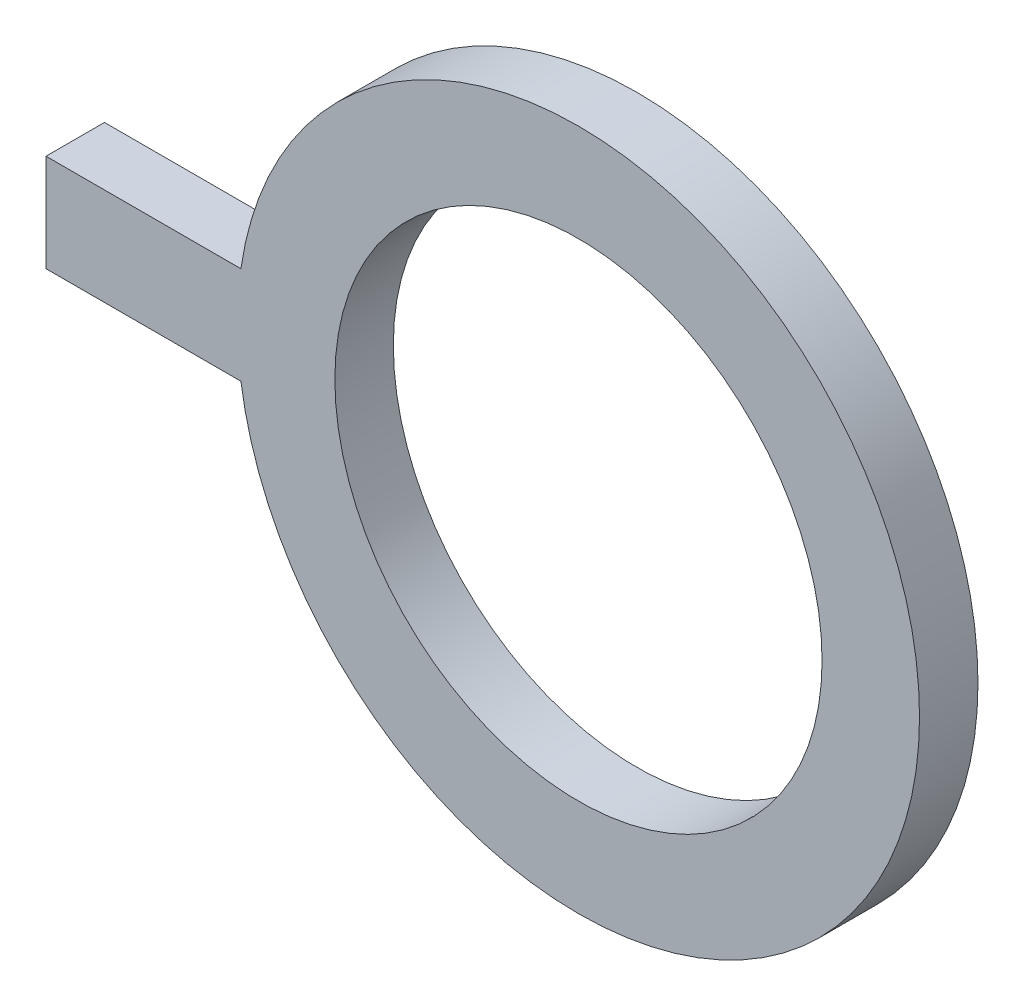
ISO-10303-21;
HEADER;
FILE_DESCRIPTION(('STEP AP214'),'2;1');
FILE_NAME('part.step','',(''),(''),'','','');
FILE_SCHEMA(('AUTOMOTIVE_DESIGN { 1 0 10303 214 1 1 1 1 }'));
ENDSEC;
DATA;
#1=APPLICATION_CONTEXT('core data for automotive mechanical design processes');
#2=APPLICATION_PROTOCOL_DEFINITION('international standard','automotive_design',2000,#1);
#3=PRODUCT_CONTEXT('',#1,'mechanical');
#4=PRODUCT('Part','Part','',(#3));
#5=PRODUCT_RELATED_PRODUCT_CATEGORY('part','',(#4));
#6=PRODUCT_DEFINITION_FORMATION('','',#4);
#7=PRODUCT_DEFINITION_CONTEXT('part definition',#1,'design');
#8=PRODUCT_DEFINITION('design','',#6,#7);
#9=PRODUCT_DEFINITION_SHAPE('','',#8);
#10=(LENGTH_UNIT() NAMED_UNIT(*) SI_UNIT(.MILLI.,.METRE.));
#11=(NAMED_UNIT(*) PLANE_ANGLE_UNIT() SI_UNIT($,.RADIAN.));
#12=(NAMED_UNIT(*) SI_UNIT($,.STERADIAN.) SOLID_ANGLE_UNIT());
#13=UNCERTAINTY_MEASURE_WITH_UNIT(LENGTH_MEASURE(1.E-05),#10,'distance_accuracy_value','');
#14=(GEOMETRIC_REPRESENTATION_CONTEXT(3) GLOBAL_UNCERTAINTY_ASSIGNED_CONTEXT((#13)) GLOBAL_UNIT_ASSIGNED_CONTEXT((#10,
#11,#12)) REPRESENTATION_CONTEXT('',''));
#15=CARTESIAN_POINT('',(0.,0.,0.));
#16=DIRECTION('',(0.,0.,1.));
#17=DIRECTION('',(1.,0.,0.));
#18=AXIS2_PLACEMENT_3D('',#15,#16,#17);
#19=CARTESIAN_POINT('',(0.,0.,6.));
#20=DIRECTION('',(0.,0.,1.));
#21=DIRECTION('',(1.,0.,0.));
#22=AXIS2_PLACEMENT_3D('',#19,#20,#21);
#23=PLANE('',#22);
#24=CARTESIAN_POINT('',(0.,0.,6.));
#25=DIRECTION('',(0.,0.,1.));
#26=DIRECTION('',(1.,0.,0.));
#27=AXIS2_PLACEMENT_3D('',#24,#25,#26);
#28=CIRCLE('',#27,35.);
#29=CARTESIAN_POINT('',(-34.6410161513775,-5.,6.));
#30=VERTEX_POINT('',#29);
#31=CARTESIAN_POINT('',(-34.6410161513775,5.,6.));
#32=VERTEX_POINT('',#31);
#33=EDGE_CURVE('E98',#30,#32,#28,.T.);
#34=ORIENTED_EDGE('',*,*,#33,.T.);
#35=DIRECTION('',(-1.,0.,0.));
#36=VECTOR('',#35,1.);
#37=CARTESIAN_POINT('',(-34.6410161513775,5.,6.));
#38=LINE('',#37,#36);
#39=CARTESIAN_POINT('',(-54.6410161513775,5.,6.));
#40=VERTEX_POINT('',#39);
#41=EDGE_CURVE('E93',#32,#40,#38,.T.);
#42=ORIENTED_EDGE('',*,*,#41,.T.);
#43=DIRECTION('',(0.,-1.,0.));
#44=VECTOR('',#43,1.);
#45=CARTESIAN_POINT('',(-54.6410161513775,-5.,6.));
#46=LINE('',#45,#44);
#47=CARTESIAN_POINT('',(-54.6410161513775,-5.,6.));
#48=VERTEX_POINT('',#47);
#49=EDGE_CURVE('E96',#40,#48,#46,.T.);
#50=ORIENTED_EDGE('',*,*,#49,.T.);
#51=DIRECTION('',(1.,0.,0.));
#52=VECTOR('',#51,1.);
#53=CARTESIAN_POINT('',(-34.6410161513775,-5.,6.));
#54=LINE('',#53,#52);
#55=EDGE_CURVE('E63',#48,#30,#54,.T.);
#56=ORIENTED_EDGE('',*,*,#55,.T.);
#57=EDGE_LOOP('',(#34,#42,#50,#56));
#58=FACE_BOUND('',#57,.T.);
#59=CARTESIAN_POINT('',(0.,0.,6.));
#60=DIRECTION('',(0.,0.,1.));
#61=DIRECTION('',(1.,0.,0.));
#62=AXIS2_PLACEMENT_3D('',#59,#60,#61);
#63=CIRCLE('',#62,25.);
#64=CARTESIAN_POINT('',(25.,0.,6.));
#65=VERTEX_POINT('',#64);
#66=EDGE_CURVE('E118',#65,#65,#63,.T.);
#67=ORIENTED_EDGE('',*,*,#66,.F.);
#68=EDGE_LOOP('',(#67));
#69=FACE_BOUND('',#68,.T.);
#70=ADVANCED_FACE('F45',(#58,#69),#23,.T.);
#71=CARTESIAN_POINT('',(0.,0.,0.));
#72=DIRECTION('',(0.,0.,1.));
#73=DIRECTION('',(1.,0.,0.));
#74=AXIS2_PLACEMENT_3D('',#71,#72,#73);
#75=PLANE('',#74);
#76=CARTESIAN_POINT('',(0.,0.,0.));
#77=DIRECTION('',(0.,0.,1.));
#78=DIRECTION('',(1.,0.,0.));
#79=AXIS2_PLACEMENT_3D('',#76,#77,#78);
#80=CIRCLE('',#79,35.);
#81=CARTESIAN_POINT('',(-34.6410161513775,-5.,0.));
#82=VERTEX_POINT('',#81);
#83=CARTESIAN_POINT('',(-34.6410161513775,5.,0.));
#84=VERTEX_POINT('',#83);
#85=EDGE_CURVE('E114',#82,#84,#80,.T.);
#86=ORIENTED_EDGE('',*,*,#85,.F.);
#87=DIRECTION('',(1.,0.,0.));
#88=VECTOR('',#87,1.);
#89=CARTESIAN_POINT('',(-34.6410161513775,-5.,0.));
#90=LINE('',#89,#88);
#91=CARTESIAN_POINT('',(-54.6410161513775,-5.,0.));
#92=VERTEX_POINT('',#91);
#93=EDGE_CURVE('E86',#92,#82,#90,.T.);
#94=ORIENTED_EDGE('',*,*,#93,.F.);
#95=DIRECTION('',(0.,-1.,0.));
#96=VECTOR('',#95,1.);
#97=CARTESIAN_POINT('',(-54.6410161513775,-5.,0.));
#98=LINE('',#97,#96);
#99=CARTESIAN_POINT('',(-54.6410161513775,5.,0.));
#100=VERTEX_POINT('',#99);
#101=EDGE_CURVE('E80',#100,#92,#98,.T.);
#102=ORIENTED_EDGE('',*,*,#101,.F.);
#103=DIRECTION('',(-1.,0.,0.));
#104=VECTOR('',#103,1.);
#105=CARTESIAN_POINT('',(-34.6410161513775,5.,0.));
#106=LINE('',#105,#104);
#107=EDGE_CURVE('E103',#84,#100,#106,.T.);
#108=ORIENTED_EDGE('',*,*,#107,.F.);
#109=EDGE_LOOP('',(#86,#94,#102,#108));
#110=FACE_BOUND('',#109,.T.);
#111=CARTESIAN_POINT('',(0.,0.,0.));
#112=DIRECTION('',(0.,0.,1.));
#113=DIRECTION('',(1.,0.,0.));
#114=AXIS2_PLACEMENT_3D('',#111,#112,#113);
#115=CIRCLE('',#114,25.);
#116=CARTESIAN_POINT('',(25.,0.,0.));
#117=VERTEX_POINT('',#116);
#118=EDGE_CURVE('E136',#117,#117,#115,.T.);
#119=ORIENTED_EDGE('',*,*,#118,.T.);
#120=EDGE_LOOP('',(#119));
#121=FACE_BOUND('',#120,.T.);
#122=ADVANCED_FACE('F131',(#110,#121),#75,.F.);
#123=CARTESIAN_POINT('',(0.,0.,6.));
#124=DIRECTION('',(0.,0.,-1.));
#125=DIRECTION('',(-1.,0.,0.));
#126=AXIS2_PLACEMENT_3D('',#123,#124,#125);
#127=CYLINDRICAL_SURFACE('',#126,35.);
#128=ORIENTED_EDGE('',*,*,#85,.T.);
#129=DIRECTION('',(0.,0.,-1.));
#130=VECTOR('',#129,1.);
#131=CARTESIAN_POINT('',(-34.6410161513775,5.,6.));
#132=LINE('',#131,#130);
#133=EDGE_CURVE('E11',#32,#84,#132,.T.);
#134=ORIENTED_EDGE('',*,*,#133,.F.);
#135=ORIENTED_EDGE('',*,*,#33,.F.);
#136=DIRECTION('',(0.,0.,-1.));
#137=VECTOR('',#136,1.);
#138=CARTESIAN_POINT('',(-34.6410161513775,-5.,6.));
#139=LINE('',#138,#137);
#140=EDGE_CURVE('E110',#30,#82,#139,.T.);
#141=ORIENTED_EDGE('',*,*,#140,.T.);
#142=EDGE_LOOP('',(#128,#134,#135,#141));
#143=FACE_BOUND('',#142,.T.);
#144=ADVANCED_FACE('F47',(#143),#127,.T.);
#145=CARTESIAN_POINT('',(-34.6410161513775,5.,6.));
#146=DIRECTION('',(0.,-1.,0.));
#147=DIRECTION('',(0.,0.,-1.));
#148=AXIS2_PLACEMENT_3D('',#145,#146,#147);
#149=PLANE('',#148);
#150=ORIENTED_EDGE('',*,*,#107,.T.);
#151=DIRECTION('',(0.,0.,-1.));
#152=VECTOR('',#151,1.);
#153=CARTESIAN_POINT('',(-54.6410161513775,5.,6.));
#154=LINE('',#153,#152);
#155=EDGE_CURVE('E55',#40,#100,#154,.T.);
#156=ORIENTED_EDGE('',*,*,#155,.F.);
#157=ORIENTED_EDGE('',*,*,#41,.F.);
#158=ORIENTED_EDGE('',*,*,#133,.T.);
#159=EDGE_LOOP('',(#150,#156,#157,#158));
#160=FACE_BOUND('',#159,.T.);
#161=ADVANCED_FACE('F102',(#160),#149,.F.);
#162=CARTESIAN_POINT('',(-54.6410161513775,-5.,6.));
#163=DIRECTION('',(1.,0.,0.));
#164=DIRECTION('',(0.,0.,-1.));
#165=AXIS2_PLACEMENT_3D('',#162,#163,#164);
#166=PLANE('',#165);
#167=ORIENTED_EDGE('',*,*,#101,.T.);
#168=DIRECTION('',(0.,0.,-1.));
#169=VECTOR('',#168,1.);
#170=CARTESIAN_POINT('',(-54.6410161513775,-5.,6.));
#171=LINE('',#170,#169);
#172=EDGE_CURVE('E105',#48,#92,#171,.T.);
#173=ORIENTED_EDGE('',*,*,#172,.F.);
#174=ORIENTED_EDGE('',*,*,#49,.F.);
#175=ORIENTED_EDGE('',*,*,#155,.T.);
#176=EDGE_LOOP('',(#167,#173,#174,#175));
#177=FACE_BOUND('',#176,.T.);
#178=ADVANCED_FACE('F106',(#177),#166,.F.);
#179=CARTESIAN_POINT('',(-34.6410161513775,-5.,6.));
#180=DIRECTION('',(0.,1.,0.));
#181=DIRECTION('',(0.,0.,1.));
#182=AXIS2_PLACEMENT_3D('',#179,#180,#181);
#183=PLANE('',#182);
#184=ORIENTED_EDGE('',*,*,#93,.T.);
#185=ORIENTED_EDGE('',*,*,#140,.F.);
#186=ORIENTED_EDGE('',*,*,#55,.F.);
#187=ORIENTED_EDGE('',*,*,#172,.T.);
#188=EDGE_LOOP('',(#184,#185,#186,#187));
#189=FACE_BOUND('',#188,.T.);
#190=ADVANCED_FACE('F128',(#189),#183,.F.);
#191=CARTESIAN_POINT('',(0.,0.,6.));
#192=DIRECTION('',(0.,0.,-1.));
#193=DIRECTION('',(-1.,0.,0.));
#194=AXIS2_PLACEMENT_3D('',#191,#192,#193);
#195=CYLINDRICAL_SURFACE('',#194,25.);
#196=ORIENTED_EDGE('',*,*,#66,.T.);
#197=EDGE_LOOP('',(#196));
#198=FACE_BOUND('',#197,.T.);
#199=ORIENTED_EDGE('',*,*,#118,.F.);
#200=EDGE_LOOP('',(#199));
#201=FACE_BOUND('',#200,.T.);
#202=ADVANCED_FACE('F144',(#198,#201),#195,.F.);
#203=CLOSED_SHELL('',(#70,#122,#144,#161,#178,#190,#202));
#204=MANIFOLD_SOLID_BREP('B2',#203);
#205=ADVANCED_BREP_SHAPE_REPRESENTATION('',(#18,#204),#14);
#206=SHAPE_DEFINITION_REPRESENTATION(#9,#205);
ENDSEC;
END-ISO-10303-21;
